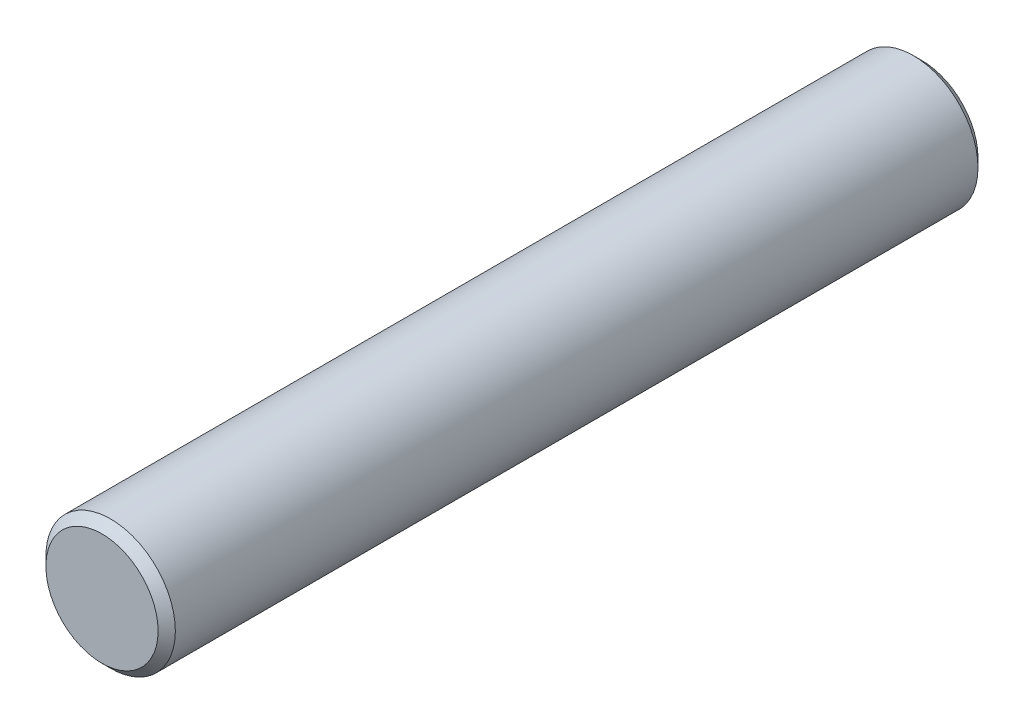
ISO-10303-21;
HEADER;
FILE_DESCRIPTION(('STEP AP214'),'2;1');
FILE_NAME('part.step','',(''),(''),'','','');
FILE_SCHEMA(('AUTOMOTIVE_DESIGN { 1 0 10303 214 1 1 1 1 }'));
ENDSEC;
DATA;
#1=APPLICATION_CONTEXT('core data for automotive mechanical design processes');
#2=APPLICATION_PROTOCOL_DEFINITION('international standard','automotive_design',2000,#1);
#3=PRODUCT_CONTEXT('',#1,'mechanical');
#4=PRODUCT('Part','Part','',(#3));
#5=PRODUCT_RELATED_PRODUCT_CATEGORY('part','',(#4));
#6=PRODUCT_DEFINITION_FORMATION('','',#4);
#7=PRODUCT_DEFINITION_CONTEXT('part definition',#1,'design');
#8=PRODUCT_DEFINITION('design','',#6,#7);
#9=PRODUCT_DEFINITION_SHAPE('','',#8);
#10=(LENGTH_UNIT() NAMED_UNIT(*) SI_UNIT(.MILLI.,.METRE.));
#11=(NAMED_UNIT(*) PLANE_ANGLE_UNIT() SI_UNIT($,.RADIAN.));
#12=(NAMED_UNIT(*) SI_UNIT($,.STERADIAN.) SOLID_ANGLE_UNIT());
#13=UNCERTAINTY_MEASURE_WITH_UNIT(LENGTH_MEASURE(1.E-05),#10,'distance_accuracy_value','');
#14=(GEOMETRIC_REPRESENTATION_CONTEXT(3) GLOBAL_UNCERTAINTY_ASSIGNED_CONTEXT((#13)) GLOBAL_UNIT_ASSIGNED_CONTEXT((#10,
#11,#12)) REPRESENTATION_CONTEXT('',''));
#15=CARTESIAN_POINT('',(0.,0.,0.));
#16=DIRECTION('',(0.,0.,1.));
#17=DIRECTION('',(1.,0.,0.));
#18=AXIS2_PLACEMENT_3D('',#15,#16,#17);
#19=CARTESIAN_POINT('',(0.,0.,19.));
#20=DIRECTION('',(0.,0.,-1.));
#21=DIRECTION('',(-1.,0.,0.));
#22=AXIS2_PLACEMENT_3D('',#19,#20,#21);
#23=CYLINDRICAL_SURFACE('',#22,1.5);
#24=CARTESIAN_POINT('',(0.,0.,0.200000000000003));
#25=DIRECTION('',(0.,0.,1.));
#26=DIRECTION('',(1.,0.,0.));
#27=AXIS2_PLACEMENT_3D('',#24,#25,#26);
#28=CIRCLE('',#27,1.5);
#29=CARTESIAN_POINT('',(1.5,0.,0.200000000000003));
#30=VERTEX_POINT('',#29);
#31=EDGE_CURVE('E27',#30,#30,#28,.T.);
#32=ORIENTED_EDGE('',*,*,#31,.T.);
#33=EDGE_LOOP('',(#32));
#34=FACE_BOUND('',#33,.T.);
#35=CARTESIAN_POINT('',(0.,0.,18.8));
#36=DIRECTION('',(0.,0.,1.));
#37=DIRECTION('',(1.,0.,0.));
#38=AXIS2_PLACEMENT_3D('',#35,#36,#37);
#39=CIRCLE('',#38,1.5);
#40=CARTESIAN_POINT('',(1.5,0.,18.8));
#41=VERTEX_POINT('',#40);
#42=EDGE_CURVE('E28',#41,#41,#39,.F.);
#43=ORIENTED_EDGE('',*,*,#42,.T.);
#44=EDGE_LOOP('',(#43));
#45=FACE_BOUND('',#44,.T.);
#46=ADVANCED_FACE('F15',(#34,#45),#23,.T.);
#47=CARTESIAN_POINT('',(0.,0.,19.));
#48=DIRECTION('',(0.,0.,1.));
#49=DIRECTION('',(1.,0.,0.));
#50=AXIS2_PLACEMENT_3D('',#47,#48,#49);
#51=PLANE('',#50);
#52=CARTESIAN_POINT('',(0.,0.,19.));
#53=DIRECTION('',(0.,0.,1.));
#54=DIRECTION('',(1.,0.,0.));
#55=AXIS2_PLACEMENT_3D('',#52,#53,#54);
#56=CIRCLE('',#55,1.3);
#57=CARTESIAN_POINT('',(1.3,0.,19.));
#58=VERTEX_POINT('',#57);
#59=EDGE_CURVE('E10',#58,#58,#56,.T.);
#60=ORIENTED_EDGE('',*,*,#59,.T.);
#61=EDGE_LOOP('',(#60));
#62=FACE_BOUND('',#61,.T.);
#63=ADVANCED_FACE('F48',(#62),#51,.T.);
#64=CARTESIAN_POINT('',(0.,0.,0.));
#65=DIRECTION('',(0.,0.,1.));
#66=DIRECTION('',(1.,0.,0.));
#67=AXIS2_PLACEMENT_3D('',#64,#65,#66);
#68=PLANE('',#67);
#69=CARTESIAN_POINT('',(0.,0.,0.));
#70=DIRECTION('',(0.,0.,1.));
#71=DIRECTION('',(1.,0.,0.));
#72=AXIS2_PLACEMENT_3D('',#69,#70,#71);
#73=CIRCLE('',#72,1.3);
#74=CARTESIAN_POINT('',(1.3,0.,0.));
#75=VERTEX_POINT('',#74);
#76=EDGE_CURVE('E22',#75,#75,#73,.F.);
#77=ORIENTED_EDGE('',*,*,#76,.T.);
#78=EDGE_LOOP('',(#77));
#79=FACE_BOUND('',#78,.T.);
#80=ADVANCED_FACE('F44',(#79),#68,.F.);
#81=CARTESIAN_POINT('',(0.,0.,0.200000000000003));
#82=DIRECTION('',(0.,0.,1.));
#83=DIRECTION('',(1.,0.,0.));
#84=AXIS2_PLACEMENT_3D('',#81,#82,#83);
#85=CONICAL_SURFACE('',#84,1.5,0.785398163397449);
#86=ORIENTED_EDGE('',*,*,#76,.F.);
#87=EDGE_LOOP('',(#86));
#88=FACE_BOUND('',#87,.T.);
#89=ORIENTED_EDGE('',*,*,#31,.F.);
#90=EDGE_LOOP('',(#89));
#91=FACE_BOUND('',#90,.T.);
#92=ADVANCED_FACE('F39',(#88,#91),#85,.T.);
#93=CARTESIAN_POINT('',(0.,0.,19.));
#94=DIRECTION('',(0.,0.,-1.));
#95=DIRECTION('',(-1.,0.,0.));
#96=AXIS2_PLACEMENT_3D('',#93,#94,#95);
#97=CONICAL_SURFACE('',#96,1.3,0.785398163397446);
#98=ORIENTED_EDGE('',*,*,#42,.F.);
#99=EDGE_LOOP('',(#98));
#100=FACE_BOUND('',#99,.T.);
#101=ORIENTED_EDGE('',*,*,#59,.F.);
#102=EDGE_LOOP('',(#101));
#103=FACE_BOUND('',#102,.T.);
#104=ADVANCED_FACE('F17',(#100,#103),#97,.T.);
#105=CLOSED_SHELL('',(#46,#63,#80,#92,#104));
#106=MANIFOLD_SOLID_BREP('B1',#105);
#107=ADVANCED_BREP_SHAPE_REPRESENTATION('',(#18,#106),#14);
#108=SHAPE_DEFINITION_REPRESENTATION(#9,#107);
ENDSEC;
END-ISO-10303-21;
